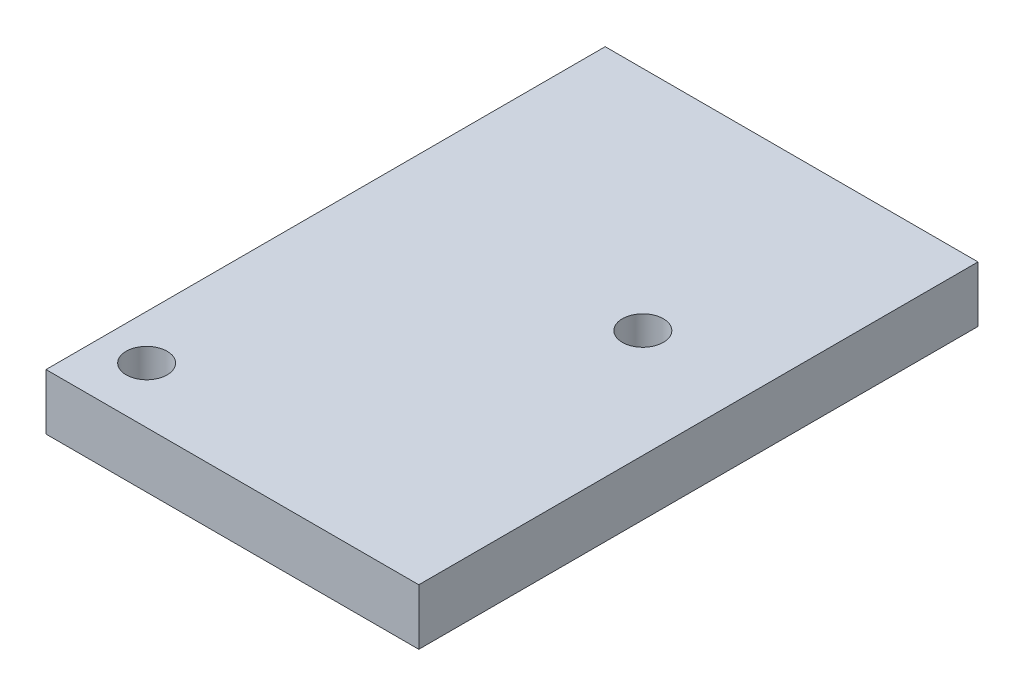
ISO-10303-21;
HEADER;
FILE_DESCRIPTION(('STEP AP214'),'2;1');
FILE_NAME('part.step','',(''),(''),'','','');
FILE_SCHEMA(('AUTOMOTIVE_DESIGN { 1 0 10303 214 1 1 1 1 }'));
ENDSEC;
DATA;
#1=APPLICATION_CONTEXT('core data for automotive mechanical design processes');
#2=APPLICATION_PROTOCOL_DEFINITION('international standard','automotive_design',2000,#1);
#3=PRODUCT_CONTEXT('',#1,'mechanical');
#4=PRODUCT('Part','Part','',(#3));
#5=PRODUCT_RELATED_PRODUCT_CATEGORY('part','',(#4));
#6=PRODUCT_DEFINITION_FORMATION('','',#4);
#7=PRODUCT_DEFINITION_CONTEXT('part definition',#1,'design');
#8=PRODUCT_DEFINITION('design','',#6,#7);
#9=PRODUCT_DEFINITION_SHAPE('','',#8);
#10=(LENGTH_UNIT() NAMED_UNIT(*) SI_UNIT(.MILLI.,.METRE.));
#11=(NAMED_UNIT(*) PLANE_ANGLE_UNIT() SI_UNIT($,.RADIAN.));
#12=(NAMED_UNIT(*) SI_UNIT($,.STERADIAN.) SOLID_ANGLE_UNIT());
#13=UNCERTAINTY_MEASURE_WITH_UNIT(LENGTH_MEASURE(1.E-05),#10,'distance_accuracy_value','');
#14=(GEOMETRIC_REPRESENTATION_CONTEXT(3) GLOBAL_UNCERTAINTY_ASSIGNED_CONTEXT((#13)) GLOBAL_UNIT_ASSIGNED_CONTEXT((#10,
#11,#12)) REPRESENTATION_CONTEXT('',''));
#15=CARTESIAN_POINT('',(0.,0.,0.));
#16=DIRECTION('',(0.,0.,1.));
#17=DIRECTION('',(1.,0.,0.));
#18=AXIS2_PLACEMENT_3D('',#15,#16,#17);
#19=CARTESIAN_POINT('',(4.2632564145606E-13,150.,1500.));
#20=DIRECTION('',(-1.,0.,0.));
#21=DIRECTION('',(0.,0.,1.));
#22=AXIS2_PLACEMENT_3D('',#19,#20,#21);
#23=PLANE('',#22);
#24=DIRECTION('',(0.,0.,-1.));
#25=VECTOR('',#24,1.);
#26=CARTESIAN_POINT('',(4.2632564145606E-13,0.,1500.));
#27=LINE('',#26,#25);
#28=CARTESIAN_POINT('',(4.2632564145606E-13,0.,1500.));
#29=VERTEX_POINT('',#28);
#30=CARTESIAN_POINT('',(0.,0.,0.));
#31=VERTEX_POINT('',#30);
#32=EDGE_CURVE('E98',#29,#31,#27,.T.);
#33=ORIENTED_EDGE('',*,*,#32,.T.);
#34=DIRECTION('',(0.,-1.,0.));
#35=VECTOR('',#34,1.);
#36=CARTESIAN_POINT('',(0.,150.,0.));
#37=LINE('',#36,#35);
#38=CARTESIAN_POINT('',(0.,150.,0.));
#39=VERTEX_POINT('',#38);
#40=EDGE_CURVE('E11',#39,#31,#37,.T.);
#41=ORIENTED_EDGE('',*,*,#40,.F.);
#42=DIRECTION('',(0.,0.,-1.));
#43=VECTOR('',#42,1.);
#44=CARTESIAN_POINT('',(4.2632564145606E-13,150.,1500.));
#45=LINE('',#44,#43);
#46=CARTESIAN_POINT('',(4.2632564145606E-13,150.,1500.));
#47=VERTEX_POINT('',#46);
#48=EDGE_CURVE('E86',#47,#39,#45,.T.);
#49=ORIENTED_EDGE('',*,*,#48,.F.);
#50=DIRECTION('',(0.,-1.,0.));
#51=VECTOR('',#50,1.);
#52=CARTESIAN_POINT('',(4.2632564145606E-13,150.,1500.));
#53=LINE('',#52,#51);
#54=EDGE_CURVE('E94',#47,#29,#53,.T.);
#55=ORIENTED_EDGE('',*,*,#54,.T.);
#56=EDGE_LOOP('',(#33,#41,#49,#55));
#57=FACE_BOUND('',#56,.T.);
#58=ADVANCED_FACE('F35',(#57),#23,.F.);
#59=CARTESIAN_POINT('',(0.,150.,0.));
#60=DIRECTION('',(0.,0.,1.));
#61=DIRECTION('',(1.,0.,0.));
#62=AXIS2_PLACEMENT_3D('',#59,#60,#61);
#63=PLANE('',#62);
#64=DIRECTION('',(-1.,0.,0.));
#65=VECTOR('',#64,1.);
#66=CARTESIAN_POINT('',(0.,0.,0.));
#67=LINE('',#66,#65);
#68=CARTESIAN_POINT('',(-1000.,0.,0.));
#69=VERTEX_POINT('',#68);
#70=EDGE_CURVE('E90',#31,#69,#67,.T.);
#71=ORIENTED_EDGE('',*,*,#70,.T.);
#72=DIRECTION('',(0.,-1.,0.));
#73=VECTOR('',#72,1.);
#74=CARTESIAN_POINT('',(-1000.,150.,0.));
#75=LINE('',#74,#73);
#76=CARTESIAN_POINT('',(-1000.,150.,0.));
#77=VERTEX_POINT('',#76);
#78=EDGE_CURVE('E43',#77,#69,#75,.T.);
#79=ORIENTED_EDGE('',*,*,#78,.F.);
#80=DIRECTION('',(-1.,0.,0.));
#81=VECTOR('',#80,1.);
#82=CARTESIAN_POINT('',(0.,150.,0.));
#83=LINE('',#82,#81);
#84=EDGE_CURVE('E81',#39,#77,#83,.T.);
#85=ORIENTED_EDGE('',*,*,#84,.F.);
#86=ORIENTED_EDGE('',*,*,#40,.T.);
#87=EDGE_LOOP('',(#71,#79,#85,#86));
#88=FACE_BOUND('',#87,.T.);
#89=ADVANCED_FACE('F89',(#88),#63,.F.);
#90=CARTESIAN_POINT('',(-1000.,150.,0.));
#91=DIRECTION('',(1.,0.,0.));
#92=DIRECTION('',(0.,0.,-1.));
#93=AXIS2_PLACEMENT_3D('',#90,#91,#92);
#94=PLANE('',#93);
#95=DIRECTION('',(0.,0.,1.));
#96=VECTOR('',#95,1.);
#97=CARTESIAN_POINT('',(-1000.,0.,0.));
#98=LINE('',#97,#96);
#99=CARTESIAN_POINT('',(-1000.,0.,1500.));
#100=VERTEX_POINT('',#99);
#101=EDGE_CURVE('E68',#69,#100,#98,.T.);
#102=ORIENTED_EDGE('',*,*,#101,.T.);
#103=DIRECTION('',(0.,-1.,0.));
#104=VECTOR('',#103,1.);
#105=CARTESIAN_POINT('',(-1000.,150.,1500.));
#106=LINE('',#105,#104);
#107=CARTESIAN_POINT('',(-1000.,150.,1500.));
#108=VERTEX_POINT('',#107);
#109=EDGE_CURVE('E91',#108,#100,#106,.T.);
#110=ORIENTED_EDGE('',*,*,#109,.F.);
#111=DIRECTION('',(0.,0.,1.));
#112=VECTOR('',#111,1.);
#113=CARTESIAN_POINT('',(-1000.,150.,0.));
#114=LINE('',#113,#112);
#115=EDGE_CURVE('E84',#77,#108,#114,.T.);
#116=ORIENTED_EDGE('',*,*,#115,.F.);
#117=ORIENTED_EDGE('',*,*,#78,.T.);
#118=EDGE_LOOP('',(#102,#110,#116,#117));
#119=FACE_BOUND('',#118,.T.);
#120=ADVANCED_FACE('F92',(#119),#94,.F.);
#121=CARTESIAN_POINT('',(-1000.,150.,1500.));
#122=DIRECTION('',(0.,0.,-1.));
#123=DIRECTION('',(-1.,0.,0.));
#124=AXIS2_PLACEMENT_3D('',#121,#122,#123);
#125=PLANE('',#124);
#126=DIRECTION('',(1.,0.,0.));
#127=VECTOR('',#126,1.);
#128=CARTESIAN_POINT('',(-1000.,0.,1500.));
#129=LINE('',#128,#127);
#130=EDGE_CURVE('E74',#100,#29,#129,.T.);
#131=ORIENTED_EDGE('',*,*,#130,.T.);
#132=ORIENTED_EDGE('',*,*,#54,.F.);
#133=DIRECTION('',(1.,0.,0.));
#134=VECTOR('',#133,1.);
#135=CARTESIAN_POINT('',(-1000.,150.,1500.));
#136=LINE('',#135,#134);
#137=EDGE_CURVE('E51',#108,#47,#136,.T.);
#138=ORIENTED_EDGE('',*,*,#137,.F.);
#139=ORIENTED_EDGE('',*,*,#109,.T.);
#140=EDGE_LOOP('',(#131,#132,#138,#139));
#141=FACE_BOUND('',#140,.T.);
#142=ADVANCED_FACE('F106',(#141),#125,.F.);
#143=CARTESIAN_POINT('',(0.,150.,0.));
#144=DIRECTION('',(0.,1.,0.));
#145=DIRECTION('',(0.,0.,1.));
#146=AXIS2_PLACEMENT_3D('',#143,#144,#145);
#147=PLANE('',#146);
#148=CARTESIAN_POINT('',(-880.,150.,1350.));
#149=DIRECTION('',(0.,1.,0.));
#150=DIRECTION('',(0.,0.,1.));
#151=AXIS2_PLACEMENT_3D('',#148,#149,#150);
#152=CIRCLE('',#151,55.);
#153=CARTESIAN_POINT('',(-880.,150.,1405.));
#154=VERTEX_POINT('',#153);
#155=EDGE_CURVE('E120',#154,#154,#152,.T.);
#156=ORIENTED_EDGE('',*,*,#155,.F.);
#157=EDGE_LOOP('',(#156));
#158=FACE_BOUND('',#157,.T.);
#159=CARTESIAN_POINT('',(-290.,150.,609.));
#160=DIRECTION('',(0.,1.,0.));
#161=DIRECTION('',(0.,0.,1.));
#162=AXIS2_PLACEMENT_3D('',#159,#160,#161);
#163=CIRCLE('',#162,55.);
#164=CARTESIAN_POINT('',(-290.,150.,664.));
#165=VERTEX_POINT('',#164);
#166=EDGE_CURVE('E112',#165,#165,#163,.T.);
#167=ORIENTED_EDGE('',*,*,#166,.F.);
#168=EDGE_LOOP('',(#167));
#169=FACE_BOUND('',#168,.T.);
#170=ORIENTED_EDGE('',*,*,#48,.T.);
#171=ORIENTED_EDGE('',*,*,#84,.T.);
#172=ORIENTED_EDGE('',*,*,#115,.T.);
#173=ORIENTED_EDGE('',*,*,#137,.T.);
#174=EDGE_LOOP('',(#170,#171,#172,#173));
#175=FACE_BOUND('',#174,.T.);
#176=ADVANCED_FACE('F82',(#158,#169,#175),#147,.T.);
#177=CARTESIAN_POINT('',(0.,0.,0.));
#178=DIRECTION('',(0.,1.,0.));
#179=DIRECTION('',(0.,0.,1.));
#180=AXIS2_PLACEMENT_3D('',#177,#178,#179);
#181=PLANE('',#180);
#182=CARTESIAN_POINT('',(-880.,0.,1350.));
#183=DIRECTION('',(0.,1.,0.));
#184=DIRECTION('',(0.,0.,1.));
#185=AXIS2_PLACEMENT_3D('',#182,#183,#184);
#186=CIRCLE('',#185,55.);
#187=CARTESIAN_POINT('',(-880.,0.,1405.));
#188=VERTEX_POINT('',#187);
#189=EDGE_CURVE('E115',#188,#188,#186,.T.);
#190=ORIENTED_EDGE('',*,*,#189,.T.);
#191=EDGE_LOOP('',(#190));
#192=FACE_BOUND('',#191,.T.);
#193=CARTESIAN_POINT('',(-290.,0.,609.));
#194=DIRECTION('',(0.,1.,0.));
#195=DIRECTION('',(0.,0.,1.));
#196=AXIS2_PLACEMENT_3D('',#193,#194,#195);
#197=CIRCLE('',#196,55.);
#198=CARTESIAN_POINT('',(-290.,0.,664.));
#199=VERTEX_POINT('',#198);
#200=EDGE_CURVE('E101',#199,#199,#197,.T.);
#201=ORIENTED_EDGE('',*,*,#200,.T.);
#202=EDGE_LOOP('',(#201));
#203=FACE_BOUND('',#202,.T.);
#204=ORIENTED_EDGE('',*,*,#32,.F.);
#205=ORIENTED_EDGE('',*,*,#130,.F.);
#206=ORIENTED_EDGE('',*,*,#101,.F.);
#207=ORIENTED_EDGE('',*,*,#70,.F.);
#208=EDGE_LOOP('',(#204,#205,#206,#207));
#209=FACE_BOUND('',#208,.T.);
#210=ADVANCED_FACE('F109',(#192,#203,#209),#181,.F.);
#211=CARTESIAN_POINT('',(-290.,0.,609.));
#212=DIRECTION('',(0.,1.,0.));
#213=DIRECTION('',(0.,0.,1.));
#214=AXIS2_PLACEMENT_3D('',#211,#212,#213);
#215=CYLINDRICAL_SURFACE('',#214,55.);
#216=ORIENTED_EDGE('',*,*,#200,.F.);
#217=EDGE_LOOP('',(#216));
#218=FACE_BOUND('',#217,.T.);
#219=ORIENTED_EDGE('',*,*,#166,.T.);
#220=EDGE_LOOP('',(#219));
#221=FACE_BOUND('',#220,.T.);
#222=ADVANCED_FACE('F131',(#218,#221),#215,.F.);
#223=CARTESIAN_POINT('',(-880.,150.,1350.));
#224=DIRECTION('',(0.,1.,0.));
#225=DIRECTION('',(0.,0.,1.));
#226=AXIS2_PLACEMENT_3D('',#223,#224,#225);
#227=CYLINDRICAL_SURFACE('',#226,55.);
#228=ORIENTED_EDGE('',*,*,#189,.F.);
#229=EDGE_LOOP('',(#228));
#230=FACE_BOUND('',#229,.T.);
#231=ORIENTED_EDGE('',*,*,#155,.T.);
#232=EDGE_LOOP('',(#231));
#233=FACE_BOUND('',#232,.T.);
#234=ADVANCED_FACE('F124',(#230,#233),#227,.F.);
#235=CLOSED_SHELL('',(#58,#89,#120,#142,#176,#210,#222,#234));
#236=MANIFOLD_SOLID_BREP('B2',#235);
#237=ADVANCED_BREP_SHAPE_REPRESENTATION('',(#18,#236),#14);
#238=SHAPE_DEFINITION_REPRESENTATION(#9,#237);
ENDSEC;
END-ISO-10303-21;
